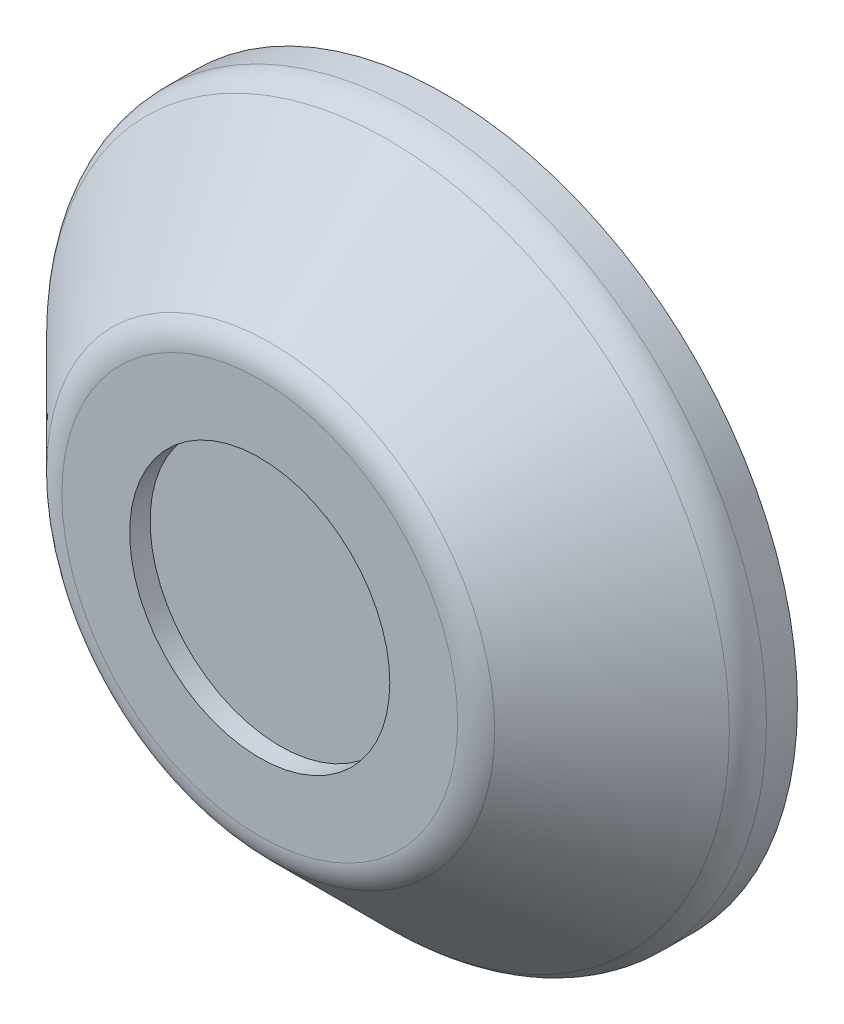
ISO-10303-21;
HEADER;
FILE_DESCRIPTION(('STEP AP214'),'2;1');
FILE_NAME('part.step','',(''),(''),'','','');
FILE_SCHEMA(('AUTOMOTIVE_DESIGN { 1 0 10303 214 1 1 1 1 }'));
ENDSEC;
DATA;
#1=APPLICATION_CONTEXT('core data for automotive mechanical design processes');
#2=APPLICATION_PROTOCOL_DEFINITION('international standard','automotive_design',2000,#1);
#3=PRODUCT_CONTEXT('',#1,'mechanical');
#4=PRODUCT('Part','Part','',(#3));
#5=PRODUCT_RELATED_PRODUCT_CATEGORY('part','',(#4));
#6=PRODUCT_DEFINITION_FORMATION('','',#4);
#7=PRODUCT_DEFINITION_CONTEXT('part definition',#1,'design');
#8=PRODUCT_DEFINITION('design','',#6,#7);
#9=PRODUCT_DEFINITION_SHAPE('','',#8);
#10=(LENGTH_UNIT() NAMED_UNIT(*) SI_UNIT(.MILLI.,.METRE.));
#11=(NAMED_UNIT(*) PLANE_ANGLE_UNIT() SI_UNIT($,.RADIAN.));
#12=(NAMED_UNIT(*) SI_UNIT($,.STERADIAN.) SOLID_ANGLE_UNIT());
#13=UNCERTAINTY_MEASURE_WITH_UNIT(LENGTH_MEASURE(1.E-05),#10,'distance_accuracy_value','');
#14=(GEOMETRIC_REPRESENTATION_CONTEXT(3) GLOBAL_UNCERTAINTY_ASSIGNED_CONTEXT((#13)) GLOBAL_UNIT_ASSIGNED_CONTEXT((#10,
#11,#12)) REPRESENTATION_CONTEXT('',''));
#15=CARTESIAN_POINT('',(0.,0.,0.));
#16=DIRECTION('',(0.,0.,1.));
#17=DIRECTION('',(1.,0.,0.));
#18=AXIS2_PLACEMENT_3D('',#15,#16,#17);
#19=CARTESIAN_POINT('',(-7.01417114,0.,-32.2));
#20=DIRECTION('',(0.,0.,1.));
#21=DIRECTION('',(1.,0.,0.));
#22=AXIS2_PLACEMENT_3D('',#19,#20,#21);
#23=PLANE('',#22);
#24=CARTESIAN_POINT('',(0.,0.,-32.2));
#25=DIRECTION('',(0.,0.,1.));
#26=DIRECTION('',(1.,0.,0.));
#27=AXIS2_PLACEMENT_3D('',#24,#25,#26);
#28=CIRCLE('',#27,14.02834228);
#29=CARTESIAN_POINT('',(14.02834228,0.,-32.2));
#30=VERTEX_POINT('',#29);
#31=EDGE_CURVE('E163',#30,#30,#28,.T.);
#32=ORIENTED_EDGE('',*,*,#31,.T.);
#33=EDGE_LOOP('',(#32));
#34=FACE_BOUND('',#33,.T.);
#35=ADVANCED_FACE('F17',(#34),#23,.T.);
#36=CARTESIAN_POINT('',(0.,0.,-31.1));
#37=DIRECTION('',(0.,0.,1.));
#38=DIRECTION('',(1.,0.,0.));
#39=AXIS2_PLACEMENT_3D('',#36,#37,#38);
#40=CYLINDRICAL_SURFACE('',#39,14.02834228);
#41=CARTESIAN_POINT('',(0.,0.,-30.));
#42=DIRECTION('',(0.,0.,1.));
#43=DIRECTION('',(1.,0.,0.));
#44=AXIS2_PLACEMENT_3D('',#41,#42,#43);
#45=CIRCLE('',#44,14.02834228);
#46=CARTESIAN_POINT('',(14.02834228,0.,-30.));
#47=VERTEX_POINT('',#46);
#48=EDGE_CURVE('E41',#47,#47,#45,.F.);
#49=ORIENTED_EDGE('',*,*,#48,.F.);
#50=EDGE_LOOP('',(#49));
#51=FACE_BOUND('',#50,.T.);
#52=ORIENTED_EDGE('',*,*,#31,.F.);
#53=EDGE_LOOP('',(#52));
#54=FACE_BOUND('',#53,.T.);
#55=ADVANCED_FACE('F132',(#51,#54),#40,.F.);
#56=CARTESIAN_POINT('',(-17.685744015,0.,-30.));
#57=DIRECTION('',(0.,0.,1.));
#58=DIRECTION('',(1.,0.,0.));
#59=AXIS2_PLACEMENT_3D('',#56,#57,#58);
#60=PLANE('',#59);
#61=ORIENTED_EDGE('',*,*,#48,.T.);
#62=EDGE_LOOP('',(#61));
#63=FACE_BOUND('',#62,.T.);
#64=CARTESIAN_POINT('',(0.,0.,-30.));
#65=DIRECTION('',(0.,0.,-1.));
#66=DIRECTION('',(-1.,0.,0.));
#67=AXIS2_PLACEMENT_3D('',#64,#65,#66);
#68=CIRCLE('',#67,21.34314575);
#69=CARTESIAN_POINT('',(-21.34314575,0.,-30.));
#70=VERTEX_POINT('',#69);
#71=CARTESIAN_POINT('',(21.34314575,0.,-30.));
#72=VERTEX_POINT('',#71);
#73=EDGE_CURVE('E34',#70,#72,#68,.T.);
#74=ORIENTED_EDGE('',*,*,#73,.F.);
#75=CARTESIAN_POINT('',(0.,0.,-30.));
#76=DIRECTION('',(0.,0.,-1.));
#77=DIRECTION('',(1.,0.,0.));
#78=AXIS2_PLACEMENT_3D('',#75,#76,#77);
#79=CIRCLE('',#78,21.34314575);
#80=EDGE_CURVE('E39',#72,#70,#79,.T.);
#81=ORIENTED_EDGE('',*,*,#80,.F.);
#82=EDGE_LOOP('',(#74,#81));
#83=FACE_BOUND('',#82,.T.);
#84=ADVANCED_FACE('F38',(#63,#83),#60,.T.);
#85=CARTESIAN_POINT('',(0.,0.,-34.));
#86=DIRECTION('',(0.,0.,-1.));
#87=DIRECTION('',(-1.,0.,0.));
#88=AXIS2_PLACEMENT_3D('',#85,#86,#87);
#89=TOROIDAL_SURFACE('',#88,21.34314575,4.);
#90=CARTESIAN_POINT('',(0.,0.,-31.1715728776269));
#91=DIRECTION('',(0.,0.,-1.));
#92=DIRECTION('',(-1.,0.,0.));
#93=AXIS2_PLACEMENT_3D('',#90,#91,#92);
#94=CIRCLE('',#93,24.1715728723731);
#95=CARTESIAN_POINT('',(-24.1715728723731,0.,-31.1715728776269));
#96=VERTEX_POINT('',#95);
#97=EDGE_CURVE('E46',#96,#96,#94,.T.);
#98=ORIENTED_EDGE('',*,*,#97,.F.);
#99=EDGE_LOOP('',(#98));
#100=FACE_BOUND('',#99,.T.);
#101=ORIENTED_EDGE('',*,*,#80,.T.);
#102=ORIENTED_EDGE('',*,*,#73,.T.);
#103=EDGE_LOOP('',(#101,#102));
#104=FACE_BOUND('',#103,.T.);
#105=ADVANCED_FACE('F45',(#100,#104),#89,.T.);
#106=CARTESIAN_POINT('',(0.,0.,-43.8284271276269));
#107=DIRECTION('',(0.,0.,-1.));
#108=DIRECTION('',(-1.,0.,0.));
#109=AXIS2_PLACEMENT_3D('',#106,#107,#108);
#110=CONICAL_SURFACE('',#109,36.8284271223731,0.785398163397448);
#111=CARTESIAN_POINT('',(0.,0.,-43.82842713));
#112=DIRECTION('',(0.,0.,-1.));
#113=DIRECTION('',(-1.,0.,0.));
#114=AXIS2_PLACEMENT_3D('',#111,#112,#113);
#115=CIRCLE('',#114,36.82842712);
#116=CARTESIAN_POINT('',(-36.82842712,0.,-43.82842713));
#117=VERTEX_POINT('',#116);
#118=EDGE_CURVE('E71',#117,#117,#115,.T.);
#119=ORIENTED_EDGE('',*,*,#118,.F.);
#120=EDGE_LOOP('',(#119));
#121=FACE_BOUND('',#120,.T.);
#122=ORIENTED_EDGE('',*,*,#97,.T.);
#123=EDGE_LOOP('',(#122));
#124=FACE_BOUND('',#123,.T.);
#125=ADVANCED_FACE('F64',(#121,#124),#110,.T.);
#126=CARTESIAN_POINT('',(0.,0.,-46.65685425));
#127=DIRECTION('',(0.,0.,-1.));
#128=DIRECTION('',(-1.,0.,0.));
#129=AXIS2_PLACEMENT_3D('',#126,#127,#128);
#130=TOROIDAL_SURFACE('',#129,34.,3.99999999328789);
#131=CARTESIAN_POINT('',(0.,0.,-46.65685425));
#132=DIRECTION('',(0.,0.,1.));
#133=DIRECTION('',(1.,0.,0.));
#134=AXIS2_PLACEMENT_3D('',#131,#132,#133);
#135=CIRCLE('',#134,37.9999999966439);
#136=CARTESIAN_POINT('',(37.9999999966439,0.,-46.65685425));
#137=VERTEX_POINT('',#136);
#138=EDGE_CURVE('E28',#137,#137,#135,.F.);
#139=ORIENTED_EDGE('',*,*,#138,.F.);
#140=EDGE_LOOP('',(#139));
#141=FACE_BOUND('',#140,.T.);
#142=ORIENTED_EDGE('',*,*,#118,.T.);
#143=EDGE_LOOP('',(#142));
#144=FACE_BOUND('',#143,.T.);
#145=ADVANCED_FACE('F84',(#141,#144),#130,.T.);
#146=CARTESIAN_POINT('',(0.,0.,-48.328427125));
#147=DIRECTION('',(0.,0.,1.));
#148=DIRECTION('',(1.,0.,0.));
#149=AXIS2_PLACEMENT_3D('',#146,#147,#148);
#150=CYLINDRICAL_SURFACE('',#149,37.9999999966439);
#151=CARTESIAN_POINT('',(0.,0.,-50.));
#152=DIRECTION('',(0.,0.,1.));
#153=DIRECTION('',(1.,0.,0.));
#154=AXIS2_PLACEMENT_3D('',#151,#152,#153);
#155=CIRCLE('',#154,37.9999999966439);
#156=CARTESIAN_POINT('',(37.9999999966439,0.,-50.));
#157=VERTEX_POINT('',#156);
#158=EDGE_CURVE('E11',#157,#157,#155,.F.);
#159=ORIENTED_EDGE('',*,*,#158,.F.);
#160=EDGE_LOOP('',(#159));
#161=FACE_BOUND('',#160,.T.);
#162=ORIENTED_EDGE('',*,*,#138,.T.);
#163=EDGE_LOOP('',(#162));
#164=FACE_BOUND('',#163,.T.);
#165=ADVANCED_FACE('F87',(#161,#164),#150,.T.);
#166=CARTESIAN_POINT('',(-19.,0.,-50.));
#167=DIRECTION('',(0.,0.,-1.));
#168=DIRECTION('',(-1.,0.,0.));
#169=AXIS2_PLACEMENT_3D('',#166,#167,#168);
#170=PLANE('',#169);
#171=ORIENTED_EDGE('',*,*,#158,.T.);
#172=EDGE_LOOP('',(#171));
#173=FACE_BOUND('',#172,.T.);
#174=ADVANCED_FACE('F91',(#173),#170,.T.);
#175=CLOSED_SHELL('',(#35,#55,#84,#105,#125,#145,#165,#174));
#176=MANIFOLD_SOLID_BREP('B1',#175);
#177=ADVANCED_BREP_SHAPE_REPRESENTATION('',(#18,#176),#14);
#178=SHAPE_DEFINITION_REPRESENTATION(#9,#177);
ENDSEC;
END-ISO-10303-21;
